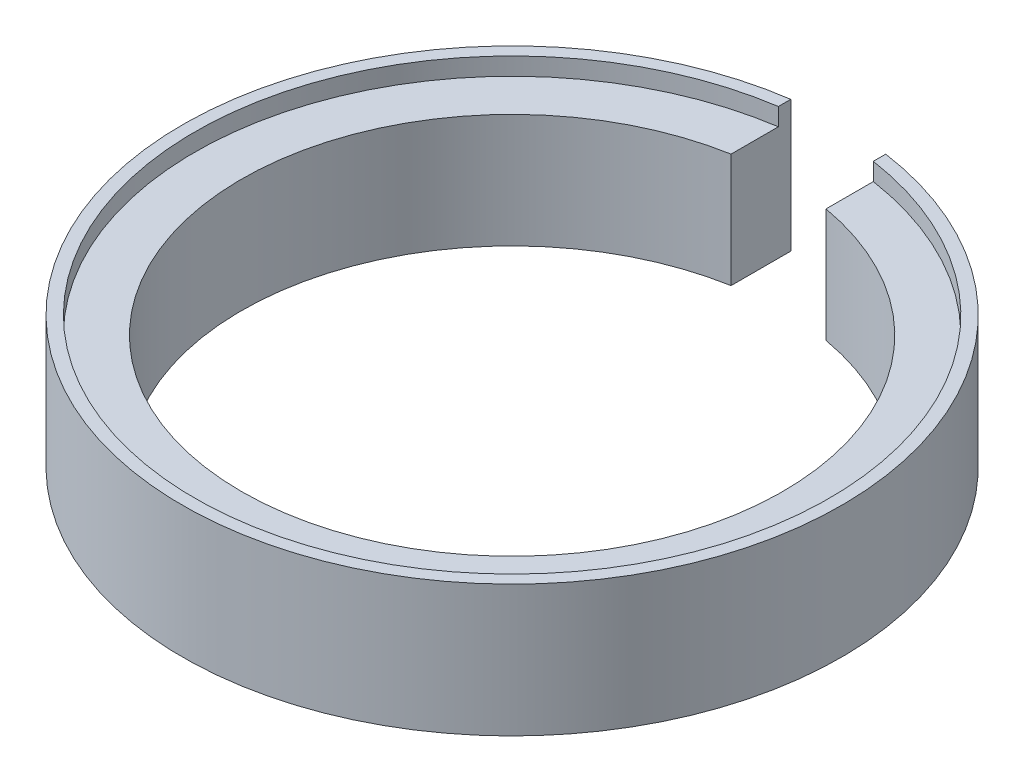
ISO-10303-21;
HEADER;
FILE_DESCRIPTION(('STEP AP214'),'2;1');
FILE_NAME('part.step','',(''),(''),'','','');
FILE_SCHEMA(('AUTOMOTIVE_DESIGN { 1 0 10303 214 1 1 1 1 }'));
ENDSEC;
DATA;
#1=APPLICATION_CONTEXT('core data for automotive mechanical design processes');
#2=APPLICATION_PROTOCOL_DEFINITION('international standard','automotive_design',2000,#1);
#3=PRODUCT_CONTEXT('',#1,'mechanical');
#4=PRODUCT('Part','Part','',(#3));
#5=PRODUCT_RELATED_PRODUCT_CATEGORY('part','',(#4));
#6=PRODUCT_DEFINITION_FORMATION('','',#4);
#7=PRODUCT_DEFINITION_CONTEXT('part definition',#1,'design');
#8=PRODUCT_DEFINITION('design','',#6,#7);
#9=PRODUCT_DEFINITION_SHAPE('','',#8);
#10=(LENGTH_UNIT() NAMED_UNIT(*) SI_UNIT(.MILLI.,.METRE.));
#11=(NAMED_UNIT(*) PLANE_ANGLE_UNIT() SI_UNIT($,.RADIAN.));
#12=(NAMED_UNIT(*) SI_UNIT($,.STERADIAN.) SOLID_ANGLE_UNIT());
#13=UNCERTAINTY_MEASURE_WITH_UNIT(LENGTH_MEASURE(1.E-05),#10,'distance_accuracy_value','');
#14=(GEOMETRIC_REPRESENTATION_CONTEXT(3) GLOBAL_UNCERTAINTY_ASSIGNED_CONTEXT((#13)) GLOBAL_UNIT_ASSIGNED_CONTEXT((#10,
#11,#12)) REPRESENTATION_CONTEXT('',''));
#15=CARTESIAN_POINT('',(0.,0.,0.));
#16=DIRECTION('',(0.,0.,1.));
#17=DIRECTION('',(1.,0.,0.));
#18=AXIS2_PLACEMENT_3D('',#15,#16,#17);
#19=CARTESIAN_POINT('',(-6.85799999999999,0.0500000000000014,-38.493867511592));
#20=DIRECTION('',(0.,1.,0.));
#21=DIRECTION('',(0.,0.,1.));
#22=AXIS2_PLACEMENT_3D('',#19,#20,#21);
#23=PLANE('',#22);
#24=DIRECTION('',(0.,0.,1.));
#25=VECTOR('',#24,1.);
#26=CARTESIAN_POINT('',(-6.85800000000001,0.0500000000000014,-50.8));
#27=LINE('',#26,#25);
#28=CARTESIAN_POINT('',(-6.85800000000001,0.0500000000000014,-47.1286373768646));
#29=VERTEX_POINT('',#28);
#30=CARTESIAN_POINT('',(-6.85799999999999,0.0500000000000014,-38.493867511592));
#31=VERTEX_POINT('',#30);
#32=EDGE_CURVE('E11',#29,#31,#27,.T.);
#33=ORIENTED_EDGE('',*,*,#32,.T.);
#34=CARTESIAN_POINT('',(0.,0.0500000000000014,0.));
#35=DIRECTION('',(0.,1.,0.));
#36=DIRECTION('',(0.,0.,1.));
#37=AXIS2_PLACEMENT_3D('',#34,#35,#36);
#38=CIRCLE('',#37,39.1);
#39=CARTESIAN_POINT('',(6.85799999999998,0.0500000000000014,-38.493867511592));
#40=VERTEX_POINT('',#39);
#41=EDGE_CURVE('E45',#31,#40,#38,.T.);
#42=ORIENTED_EDGE('',*,*,#41,.T.);
#43=DIRECTION('',(0.,0.,1.));
#44=VECTOR('',#43,1.);
#45=CARTESIAN_POINT('',(6.85799999999999,0.0500000000000014,-50.8));
#46=LINE('',#45,#44);
#47=CARTESIAN_POINT('',(6.85799999999999,0.0500000000000014,-47.1286373768646));
#48=VERTEX_POINT('',#47);
#49=EDGE_CURVE('E59',#48,#40,#46,.T.);
#50=ORIENTED_EDGE('',*,*,#49,.F.);
#51=CARTESIAN_POINT('',(0.,0.0500000000000014,0.));
#52=DIRECTION('',(0.,1.,0.));
#53=DIRECTION('',(0.,0.,1.));
#54=AXIS2_PLACEMENT_3D('',#51,#52,#53);
#55=CIRCLE('',#54,47.625);
#56=EDGE_CURVE('E40',#48,#29,#55,.F.);
#57=ORIENTED_EDGE('',*,*,#56,.T.);
#58=EDGE_LOOP('',(#33,#42,#50,#57));
#59=FACE_BOUND('',#58,.T.);
#60=ADVANCED_FACE('F37',(#59),#23,.F.);
#61=CARTESIAN_POINT('',(-6.85800000000001,0.0500000000000014,-50.8));
#62=DIRECTION('',(-1.,0.,0.));
#63=DIRECTION('',(0.,0.,1.));
#64=AXIS2_PLACEMENT_3D('',#61,#62,#63);
#65=PLANE('',#64);
#66=DIRECTION('',(0.,0.,1.));
#67=VECTOR('',#66,1.);
#68=CARTESIAN_POINT('',(-6.858,19.05,0.));
#69=LINE('',#68,#67);
#70=CARTESIAN_POINT('',(-6.85800000000001,19.05,-47.1286373768646));
#71=VERTEX_POINT('',#70);
#72=CARTESIAN_POINT('',(-6.85800000000001,19.05,-45.3311729938681));
#73=VERTEX_POINT('',#72);
#74=EDGE_CURVE('E115',#71,#73,#69,.T.);
#75=ORIENTED_EDGE('',*,*,#74,.T.);
#76=DIRECTION('',(0.,1.,0.));
#77=VECTOR('',#76,1.);
#78=CARTESIAN_POINT('',(-6.85800000000001,16.51,-45.3311729938681));
#79=LINE('',#78,#77);
#80=CARTESIAN_POINT('',(-6.85800000000001,16.51,-45.3311729938681));
#81=VERTEX_POINT('',#80);
#82=EDGE_CURVE('E98',#73,#81,#79,.F.);
#83=ORIENTED_EDGE('',*,*,#82,.T.);
#84=DIRECTION('',(0.,0.,-1.));
#85=VECTOR('',#84,1.);
#86=CARTESIAN_POINT('',(-6.85800000000001,16.51,-50.8));
#87=LINE('',#86,#85);
#88=CARTESIAN_POINT('',(-6.85799999999999,16.51,-38.493867511592));
#89=VERTEX_POINT('',#88);
#90=EDGE_CURVE('E126',#89,#81,#87,.T.);
#91=ORIENTED_EDGE('',*,*,#90,.F.);
#92=DIRECTION('',(0.,1.,0.));
#93=VECTOR('',#92,1.);
#94=CARTESIAN_POINT('',(-6.85799999999999,0.0500000000000014,-38.493867511592));
#95=LINE('',#94,#93);
#96=EDGE_CURVE('E131',#31,#89,#95,.T.);
#97=ORIENTED_EDGE('',*,*,#96,.F.);
#98=ORIENTED_EDGE('',*,*,#32,.F.);
#99=DIRECTION('',(0.,1.,0.));
#100=VECTOR('',#99,1.);
#101=CARTESIAN_POINT('',(-6.85800000000001,-6.35,-47.1286373768646));
#102=LINE('',#101,#100);
#103=EDGE_CURVE('E118',#29,#71,#102,.T.);
#104=ORIENTED_EDGE('',*,*,#103,.T.);
#105=EDGE_LOOP('',(#75,#83,#91,#97,#98,#104));
#106=FACE_BOUND('',#105,.T.);
#107=ADVANCED_FACE('F129',(#106),#65,.F.);
#108=CARTESIAN_POINT('',(0.,16.51,0.));
#109=DIRECTION('',(0.,1.,0.));
#110=DIRECTION('',(0.,0.,1.));
#111=AXIS2_PLACEMENT_3D('',#108,#109,#110);
#112=PLANE('',#111);
#113=ORIENTED_EDGE('',*,*,#90,.T.);
#114=CARTESIAN_POINT('',(0.,16.51,0.));
#115=DIRECTION('',(0.,1.,0.));
#116=DIRECTION('',(0.,0.,1.));
#117=AXIS2_PLACEMENT_3D('',#114,#115,#116);
#118=CIRCLE('',#117,45.847);
#119=CARTESIAN_POINT('',(6.85799999999999,16.51,-45.3311729938681));
#120=VERTEX_POINT('',#119);
#121=EDGE_CURVE('E103',#81,#120,#118,.T.);
#122=ORIENTED_EDGE('',*,*,#121,.T.);
#123=DIRECTION('',(0.,0.,-1.));
#124=VECTOR('',#123,1.);
#125=CARTESIAN_POINT('',(6.85799999999999,16.51,-50.8));
#126=LINE('',#125,#124);
#127=CARTESIAN_POINT('',(6.85799999999998,16.51,-38.493867511592));
#128=VERTEX_POINT('',#127);
#129=EDGE_CURVE('E109',#128,#120,#126,.T.);
#130=ORIENTED_EDGE('',*,*,#129,.F.);
#131=CARTESIAN_POINT('',(0.,16.51,0.));
#132=DIRECTION('',(0.,1.,0.));
#133=DIRECTION('',(0.,0.,1.));
#134=AXIS2_PLACEMENT_3D('',#131,#132,#133);
#135=CIRCLE('',#134,39.1);
#136=EDGE_CURVE('E110',#128,#89,#135,.F.);
#137=ORIENTED_EDGE('',*,*,#136,.T.);
#138=EDGE_LOOP('',(#113,#122,#130,#137));
#139=FACE_BOUND('',#138,.T.);
#140=ADVANCED_FACE('F125',(#139),#112,.T.);
#141=CARTESIAN_POINT('',(0.,0.0500000000000014,0.));
#142=DIRECTION('',(0.,1.,0.));
#143=DIRECTION('',(0.,0.,1.));
#144=AXIS2_PLACEMENT_3D('',#141,#142,#143);
#145=CYLINDRICAL_SURFACE('',#144,39.1);
#146=ORIENTED_EDGE('',*,*,#136,.F.);
#147=DIRECTION('',(0.,1.,0.));
#148=VECTOR('',#147,1.);
#149=CARTESIAN_POINT('',(6.85799999999998,0.0500000000000014,-38.493867511592));
#150=LINE('',#149,#148);
#151=EDGE_CURVE('E134',#40,#128,#150,.T.);
#152=ORIENTED_EDGE('',*,*,#151,.F.);
#153=ORIENTED_EDGE('',*,*,#41,.F.);
#154=ORIENTED_EDGE('',*,*,#96,.T.);
#155=EDGE_LOOP('',(#146,#152,#153,#154));
#156=FACE_BOUND('',#155,.T.);
#157=ADVANCED_FACE('F133',(#156),#145,.F.);
#158=CARTESIAN_POINT('',(0.,19.05,0.));
#159=DIRECTION('',(0.,1.,0.));
#160=DIRECTION('',(0.,0.,1.));
#161=AXIS2_PLACEMENT_3D('',#158,#159,#160);
#162=PLANE('',#161);
#163=CARTESIAN_POINT('',(0.,19.05,0.));
#164=DIRECTION('',(0.,1.,0.));
#165=DIRECTION('',(0.,0.,1.));
#166=AXIS2_PLACEMENT_3D('',#163,#164,#165);
#167=CIRCLE('',#166,45.847);
#168=CARTESIAN_POINT('',(6.85799999999999,19.05,-45.3311729938681));
#169=VERTEX_POINT('',#168);
#170=EDGE_CURVE('E91',#73,#169,#167,.T.);
#171=ORIENTED_EDGE('',*,*,#170,.F.);
#172=ORIENTED_EDGE('',*,*,#74,.F.);
#173=CARTESIAN_POINT('',(0.,19.05,0.));
#174=DIRECTION('',(0.,1.,0.));
#175=DIRECTION('',(0.,0.,1.));
#176=AXIS2_PLACEMENT_3D('',#173,#174,#175);
#177=CIRCLE('',#176,47.625);
#178=CARTESIAN_POINT('',(6.85799999999999,19.05,-47.1286373768646));
#179=VERTEX_POINT('',#178);
#180=EDGE_CURVE('E114',#71,#179,#177,.T.);
#181=ORIENTED_EDGE('',*,*,#180,.T.);
#182=DIRECTION('',(0.,0.,1.));
#183=VECTOR('',#182,1.);
#184=CARTESIAN_POINT('',(6.858,19.05,0.));
#185=LINE('',#184,#183);
#186=EDGE_CURVE('E107',#179,#169,#185,.T.);
#187=ORIENTED_EDGE('',*,*,#186,.T.);
#188=EDGE_LOOP('',(#171,#172,#181,#187));
#189=FACE_BOUND('',#188,.T.);
#190=ADVANCED_FACE('F112',(#189),#162,.T.);
#191=CARTESIAN_POINT('',(0.,16.51,0.));
#192=DIRECTION('',(0.,1.,0.));
#193=DIRECTION('',(0.,0.,1.));
#194=AXIS2_PLACEMENT_3D('',#191,#192,#193);
#195=CYLINDRICAL_SURFACE('',#194,45.847);
#196=ORIENTED_EDGE('',*,*,#170,.T.);
#197=DIRECTION('',(0.,1.,0.));
#198=VECTOR('',#197,1.);
#199=CARTESIAN_POINT('',(6.85799999999999,16.51,-45.3311729938681));
#200=LINE('',#199,#198);
#201=EDGE_CURVE('E95',#169,#120,#200,.F.);
#202=ORIENTED_EDGE('',*,*,#201,.T.);
#203=ORIENTED_EDGE('',*,*,#121,.F.);
#204=ORIENTED_EDGE('',*,*,#82,.F.);
#205=EDGE_LOOP('',(#196,#202,#203,#204));
#206=FACE_BOUND('',#205,.T.);
#207=ADVANCED_FACE('F93',(#206),#195,.F.);
#208=CARTESIAN_POINT('',(6.85799999999999,0.0500000000000014,-50.8));
#209=DIRECTION('',(-1.,0.,0.));
#210=DIRECTION('',(0.,0.,1.));
#211=AXIS2_PLACEMENT_3D('',#208,#209,#210);
#212=PLANE('',#211);
#213=ORIENTED_EDGE('',*,*,#201,.F.);
#214=ORIENTED_EDGE('',*,*,#186,.F.);
#215=DIRECTION('',(0.,1.,0.));
#216=VECTOR('',#215,1.);
#217=CARTESIAN_POINT('',(6.85799999999999,-6.35,-47.1286373768646));
#218=LINE('',#217,#216);
#219=EDGE_CURVE('E136',#48,#179,#218,.T.);
#220=ORIENTED_EDGE('',*,*,#219,.F.);
#221=ORIENTED_EDGE('',*,*,#49,.T.);
#222=ORIENTED_EDGE('',*,*,#151,.T.);
#223=ORIENTED_EDGE('',*,*,#129,.T.);
#224=EDGE_LOOP('',(#213,#214,#220,#221,#222,#223));
#225=FACE_BOUND('',#224,.T.);
#226=ADVANCED_FACE('F106',(#225),#212,.T.);
#227=CARTESIAN_POINT('',(0.,-6.35,0.));
#228=DIRECTION('',(0.,1.,0.));
#229=DIRECTION('',(0.,0.,1.));
#230=AXIS2_PLACEMENT_3D('',#227,#228,#229);
#231=CYLINDRICAL_SURFACE('',#230,47.625);
#232=ORIENTED_EDGE('',*,*,#56,.F.);
#233=ORIENTED_EDGE('',*,*,#219,.T.);
#234=ORIENTED_EDGE('',*,*,#180,.F.);
#235=ORIENTED_EDGE('',*,*,#103,.F.);
#236=EDGE_LOOP('',(#232,#233,#234,#235));
#237=FACE_BOUND('',#236,.T.);
#238=ADVANCED_FACE('F142',(#237),#231,.T.);
#239=CLOSED_SHELL('',(#60,#107,#140,#157,#190,#207,#226,#238));
#240=MANIFOLD_SOLID_BREP('B2',#239);
#241=ADVANCED_BREP_SHAPE_REPRESENTATION('',(#18,#240),#14);
#242=SHAPE_DEFINITION_REPRESENTATION(#9,#241);
ENDSEC;
END-ISO-10303-21;
